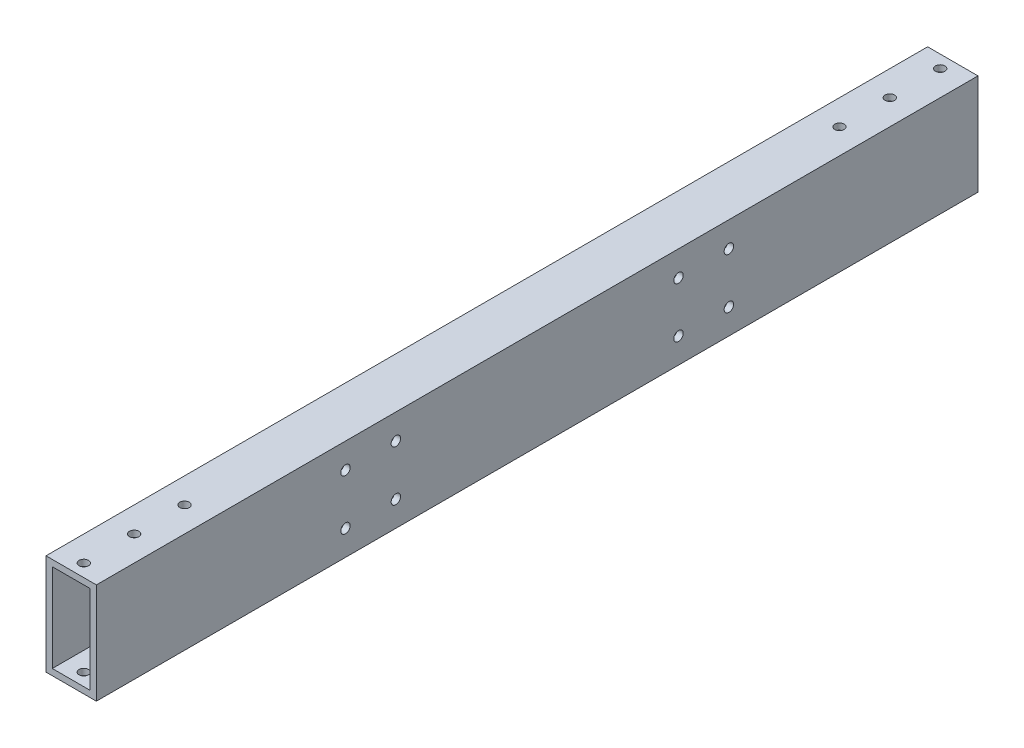
ISO-10303-21;
HEADER;
FILE_DESCRIPTION(('STEP AP214'),'2;1');
FILE_NAME('part.step','',(''),(''),'','','');
FILE_SCHEMA(('AUTOMOTIVE_DESIGN { 1 0 10303 214 1 1 1 1 }'));
ENDSEC;
DATA;
#1=APPLICATION_CONTEXT('core data for automotive mechanical design processes');
#2=APPLICATION_PROTOCOL_DEFINITION('international standard','automotive_design',2000,#1);
#3=PRODUCT_CONTEXT('',#1,'mechanical');
#4=PRODUCT('Part','Part','',(#3));
#5=PRODUCT_RELATED_PRODUCT_CATEGORY('part','',(#4));
#6=PRODUCT_DEFINITION_FORMATION('','',#4);
#7=PRODUCT_DEFINITION_CONTEXT('part definition',#1,'design');
#8=PRODUCT_DEFINITION('design','',#6,#7);
#9=PRODUCT_DEFINITION_SHAPE('','',#8);
#10=(LENGTH_UNIT() NAMED_UNIT(*) SI_UNIT(.MILLI.,.METRE.));
#11=(NAMED_UNIT(*) PLANE_ANGLE_UNIT() SI_UNIT($,.RADIAN.));
#12=(NAMED_UNIT(*) SI_UNIT($,.STERADIAN.) SOLID_ANGLE_UNIT());
#13=UNCERTAINTY_MEASURE_WITH_UNIT(LENGTH_MEASURE(1.E-05),#10,'distance_accuracy_value','');
#14=(GEOMETRIC_REPRESENTATION_CONTEXT(3) GLOBAL_UNCERTAINTY_ASSIGNED_CONTEXT((#13)) GLOBAL_UNIT_ASSIGNED_CONTEXT((#10,
#11,#12)) REPRESENTATION_CONTEXT('',''));
#15=CARTESIAN_POINT('',(0.,0.,0.));
#16=DIRECTION('',(0.,0.,1.));
#17=DIRECTION('',(1.,0.,0.));
#18=AXIS2_PLACEMENT_3D('',#15,#16,#17);
#19=CARTESIAN_POINT('',(12.7,25.4000000000001,444.5));
#20=DIRECTION('',(-1.,0.,0.));
#21=DIRECTION('',(0.,-1.,0.));
#22=AXIS2_PLACEMENT_3D('',#19,#20,#21);
#23=PLANE('',#22);
#24=CARTESIAN_POINT('',(12.7,12.7000000000001,125.603));
#25=DIRECTION('',(1.,0.,0.));
#26=DIRECTION('',(0.,1.,0.));
#27=AXIS2_PLACEMENT_3D('',#24,#25,#26);
#28=CIRCLE('',#27,2.38125000000001);
#29=CARTESIAN_POINT('',(12.7,15.0812500000001,125.603));
#30=VERTEX_POINT('',#29);
#31=EDGE_CURVE('E321',#30,#30,#28,.T.);
#32=ORIENTED_EDGE('',*,*,#31,.F.);
#33=EDGE_LOOP('',(#32));
#34=FACE_BOUND('',#33,.T.);
#35=CARTESIAN_POINT('',(12.7,12.7000000000001,151.003));
#36=DIRECTION('',(1.,0.,0.));
#37=DIRECTION('',(0.,1.,0.));
#38=AXIS2_PLACEMENT_3D('',#35,#36,#37);
#39=CIRCLE('',#38,2.38125000000001);
#40=CARTESIAN_POINT('',(12.7,15.0812500000001,151.003));
#41=VERTEX_POINT('',#40);
#42=EDGE_CURVE('E325',#41,#41,#39,.T.);
#43=ORIENTED_EDGE('',*,*,#42,.F.);
#44=EDGE_LOOP('',(#43));
#45=FACE_BOUND('',#44,.T.);
#46=CARTESIAN_POINT('',(12.7,-12.6999999999999,151.003));
#47=DIRECTION('',(1.,0.,0.));
#48=DIRECTION('',(0.,1.,0.));
#49=AXIS2_PLACEMENT_3D('',#46,#47,#48);
#50=CIRCLE('',#49,2.38125000000001);
#51=CARTESIAN_POINT('',(12.7,-10.3187499999999,151.003));
#52=VERTEX_POINT('',#51);
#53=EDGE_CURVE('E329',#52,#52,#50,.T.);
#54=ORIENTED_EDGE('',*,*,#53,.F.);
#55=EDGE_LOOP('',(#54));
#56=FACE_BOUND('',#55,.T.);
#57=CARTESIAN_POINT('',(12.7,-12.6999999999999,293.497));
#58=DIRECTION('',(1.,0.,0.));
#59=DIRECTION('',(0.,-1.,0.));
#60=AXIS2_PLACEMENT_3D('',#57,#58,#59);
#61=CIRCLE('',#60,2.38124999999995);
#62=CARTESIAN_POINT('',(12.7,-15.0812499999999,293.497));
#63=VERTEX_POINT('',#62);
#64=EDGE_CURVE('E333',#63,#63,#61,.T.);
#65=ORIENTED_EDGE('',*,*,#64,.F.);
#66=EDGE_LOOP('',(#65));
#67=FACE_BOUND('',#66,.T.);
#68=CARTESIAN_POINT('',(12.7,12.7000000000001,293.497));
#69=DIRECTION('',(1.,0.,0.));
#70=DIRECTION('',(0.,-1.,0.));
#71=AXIS2_PLACEMENT_3D('',#68,#69,#70);
#72=CIRCLE('',#71,2.38125000000001);
#73=CARTESIAN_POINT('',(12.7,10.3187500000001,293.497));
#74=VERTEX_POINT('',#73);
#75=EDGE_CURVE('E337',#74,#74,#72,.T.);
#76=ORIENTED_EDGE('',*,*,#75,.F.);
#77=EDGE_LOOP('',(#76));
#78=FACE_BOUND('',#77,.T.);
#79=CARTESIAN_POINT('',(12.7,12.7,318.897));
#80=DIRECTION('',(1.,0.,0.));
#81=DIRECTION('',(0.,-1.,0.));
#82=AXIS2_PLACEMENT_3D('',#79,#80,#81);
#83=CIRCLE('',#82,2.38124999999995);
#84=CARTESIAN_POINT('',(12.7,10.3187500000001,318.897));
#85=VERTEX_POINT('',#84);
#86=EDGE_CURVE('E341',#85,#85,#83,.T.);
#87=ORIENTED_EDGE('',*,*,#86,.F.);
#88=EDGE_LOOP('',(#87));
#89=FACE_BOUND('',#88,.T.);
#90=CARTESIAN_POINT('',(12.7,-12.6999999999999,318.897));
#91=DIRECTION('',(1.,0.,0.));
#92=DIRECTION('',(0.,-1.,0.));
#93=AXIS2_PLACEMENT_3D('',#90,#91,#92);
#94=CIRCLE('',#93,2.38125000000001);
#95=CARTESIAN_POINT('',(12.7,-15.08125,318.897));
#96=VERTEX_POINT('',#95);
#97=EDGE_CURVE('E345',#96,#96,#94,.T.);
#98=ORIENTED_EDGE('',*,*,#97,.F.);
#99=EDGE_LOOP('',(#98));
#100=FACE_BOUND('',#99,.T.);
#101=CARTESIAN_POINT('',(12.7,-12.6999999999999,125.603));
#102=DIRECTION('',(1.,0.,0.));
#103=DIRECTION('',(0.,1.,0.));
#104=AXIS2_PLACEMENT_3D('',#101,#102,#103);
#105=CIRCLE('',#104,2.38125000000001);
#106=CARTESIAN_POINT('',(12.7,-10.3187499999999,125.603));
#107=VERTEX_POINT('',#106);
#108=EDGE_CURVE('E225',#107,#107,#105,.T.);
#109=ORIENTED_EDGE('',*,*,#108,.F.);
#110=EDGE_LOOP('',(#109));
#111=FACE_BOUND('',#110,.T.);
#112=DIRECTION('',(0.,1.,0.));
#113=VECTOR('',#112,1.);
#114=CARTESIAN_POINT('',(12.7,25.4000000000001,0.));
#115=LINE('',#114,#113);
#116=CARTESIAN_POINT('',(12.7,-25.3999999999999,0.));
#117=VERTEX_POINT('',#116);
#118=CARTESIAN_POINT('',(12.7,25.4000000000001,0.));
#119=VERTEX_POINT('',#118);
#120=EDGE_CURVE('E168',#117,#119,#115,.T.);
#121=ORIENTED_EDGE('',*,*,#120,.T.);
#122=DIRECTION('',(0.,0.,-1.));
#123=VECTOR('',#122,1.);
#124=CARTESIAN_POINT('',(12.7,25.4000000000001,444.5));
#125=LINE('',#124,#123);
#126=CARTESIAN_POINT('',(12.7,25.4000000000001,444.5));
#127=VERTEX_POINT('',#126);
#128=EDGE_CURVE('E11',#127,#119,#125,.T.);
#129=ORIENTED_EDGE('',*,*,#128,.F.);
#130=DIRECTION('',(0.,1.,0.));
#131=VECTOR('',#130,1.);
#132=CARTESIAN_POINT('',(12.7,25.4000000000001,444.5));
#133=LINE('',#132,#131);
#134=CARTESIAN_POINT('',(12.7,-25.3999999999999,444.5));
#135=VERTEX_POINT('',#134);
#136=EDGE_CURVE('E153',#135,#127,#133,.T.);
#137=ORIENTED_EDGE('',*,*,#136,.F.);
#138=DIRECTION('',(0.,0.,-1.));
#139=VECTOR('',#138,1.);
#140=CARTESIAN_POINT('',(12.7,-25.3999999999999,444.5));
#141=LINE('',#140,#139);
#142=EDGE_CURVE('E167',#135,#117,#141,.T.);
#143=ORIENTED_EDGE('',*,*,#142,.T.);
#144=EDGE_LOOP('',(#121,#129,#137,#143));
#145=FACE_BOUND('',#144,.T.);
#146=ADVANCED_FACE('F41',(#34,#45,#56,#67,#78,#89,#100,#111,#145),#23,.F.);
#147=CARTESIAN_POINT('',(-12.7,25.4000000000001,444.5));
#148=DIRECTION('',(0.,-1.,0.));
#149=DIRECTION('',(0.,0.,-1.));
#150=AXIS2_PLACEMENT_3D('',#147,#148,#149);
#151=PLANE('',#150);
#152=CARTESIAN_POINT('',(0.,25.4000000000001,6.35));
#153=DIRECTION('',(0.,1.,0.));
#154=DIRECTION('',(0.,0.,1.));
#155=AXIS2_PLACEMENT_3D('',#152,#153,#154);
#156=CIRCLE('',#155,2.38125);
#157=CARTESIAN_POINT('',(0.,25.4000000000001,8.73125));
#158=VERTEX_POINT('',#157);
#159=EDGE_CURVE('E435',#158,#158,#156,.T.);
#160=ORIENTED_EDGE('',*,*,#159,.F.);
#161=EDGE_LOOP('',(#160));
#162=FACE_BOUND('',#161,.T.);
#163=CARTESIAN_POINT('',(0.,25.4000000000001,31.75));
#164=DIRECTION('',(0.,1.,0.));
#165=DIRECTION('',(0.,0.,1.));
#166=AXIS2_PLACEMENT_3D('',#163,#164,#165);
#167=CIRCLE('',#166,2.38125);
#168=CARTESIAN_POINT('',(0.,25.4000000000001,34.13125));
#169=VERTEX_POINT('',#168);
#170=EDGE_CURVE('E432',#169,#169,#167,.T.);
#171=ORIENTED_EDGE('',*,*,#170,.F.);
#172=EDGE_LOOP('',(#171));
#173=FACE_BOUND('',#172,.T.);
#174=CARTESIAN_POINT('',(0.,25.4000000000001,57.15));
#175=DIRECTION('',(0.,1.,0.));
#176=DIRECTION('',(0.,0.,1.));
#177=AXIS2_PLACEMENT_3D('',#174,#175,#176);
#178=CIRCLE('',#177,2.38125);
#179=CARTESIAN_POINT('',(0.,25.4000000000001,59.53125));
#180=VERTEX_POINT('',#179);
#181=EDGE_CURVE('E424',#180,#180,#178,.T.);
#182=ORIENTED_EDGE('',*,*,#181,.F.);
#183=EDGE_LOOP('',(#182));
#184=FACE_BOUND('',#183,.T.);
#185=CARTESIAN_POINT('',(0.,25.4000000000001,387.35));
#186=DIRECTION('',(0.,1.,0.));
#187=DIRECTION('',(0.,0.,-1.));
#188=AXIS2_PLACEMENT_3D('',#185,#186,#187);
#189=CIRCLE('',#188,2.38124999999998);
#190=CARTESIAN_POINT('',(0.,25.4000000000001,384.96875));
#191=VERTEX_POINT('',#190);
#192=EDGE_CURVE('E416',#191,#191,#189,.T.);
#193=ORIENTED_EDGE('',*,*,#192,.F.);
#194=EDGE_LOOP('',(#193));
#195=FACE_BOUND('',#194,.T.);
#196=CARTESIAN_POINT('',(0.,25.4000000000001,412.75));
#197=DIRECTION('',(0.,1.,0.));
#198=DIRECTION('',(0.,0.,-1.));
#199=AXIS2_PLACEMENT_3D('',#196,#197,#198);
#200=CIRCLE('',#199,2.38124999999998);
#201=CARTESIAN_POINT('',(0.,25.4000000000001,410.36875));
#202=VERTEX_POINT('',#201);
#203=EDGE_CURVE('E407',#202,#202,#200,.T.);
#204=ORIENTED_EDGE('',*,*,#203,.F.);
#205=EDGE_LOOP('',(#204));
#206=FACE_BOUND('',#205,.T.);
#207=CARTESIAN_POINT('',(0.,25.4000000000001,438.15));
#208=DIRECTION('',(0.,1.,0.));
#209=DIRECTION('',(0.,0.,-1.));
#210=AXIS2_PLACEMENT_3D('',#207,#208,#209);
#211=CIRCLE('',#210,2.38125000000002);
#212=CARTESIAN_POINT('',(0.,25.4000000000001,435.76875));
#213=VERTEX_POINT('',#212);
#214=EDGE_CURVE('E257',#213,#213,#211,.T.);
#215=ORIENTED_EDGE('',*,*,#214,.F.);
#216=EDGE_LOOP('',(#215));
#217=FACE_BOUND('',#216,.T.);
#218=DIRECTION('',(-1.,0.,0.));
#219=VECTOR('',#218,1.);
#220=CARTESIAN_POINT('',(-12.7,25.4000000000001,0.));
#221=LINE('',#220,#219);
#222=CARTESIAN_POINT('',(-12.7,25.4000000000001,0.));
#223=VERTEX_POINT('',#222);
#224=EDGE_CURVE('E172',#119,#223,#221,.T.);
#225=ORIENTED_EDGE('',*,*,#224,.T.);
#226=DIRECTION('',(0.,0.,-1.));
#227=VECTOR('',#226,1.);
#228=CARTESIAN_POINT('',(-12.7,25.4000000000001,444.5));
#229=LINE('',#228,#227);
#230=CARTESIAN_POINT('',(-12.7,25.4000000000001,444.5));
#231=VERTEX_POINT('',#230);
#232=EDGE_CURVE('E50',#231,#223,#229,.T.);
#233=ORIENTED_EDGE('',*,*,#232,.F.);
#234=DIRECTION('',(-1.,0.,0.));
#235=VECTOR('',#234,1.);
#236=CARTESIAN_POINT('',(-12.7,25.4000000000001,444.5));
#237=LINE('',#236,#235);
#238=EDGE_CURVE('E157',#127,#231,#237,.T.);
#239=ORIENTED_EDGE('',*,*,#238,.F.);
#240=ORIENTED_EDGE('',*,*,#128,.T.);
#241=EDGE_LOOP('',(#225,#233,#239,#240));
#242=FACE_BOUND('',#241,.T.);
#243=ADVANCED_FACE('F311',(#162,#173,#184,#195,#206,#217,#242),#151,.F.);
#244=CARTESIAN_POINT('',(-12.7,25.4000000000001,444.5));
#245=DIRECTION('',(1.,0.,0.));
#246=DIRECTION('',(0.,1.,0.));
#247=AXIS2_PLACEMENT_3D('',#244,#245,#246);
#248=PLANE('',#247);
#249=DIRECTION('',(0.,-1.,0.));
#250=VECTOR('',#249,1.);
#251=CARTESIAN_POINT('',(-12.7,25.4000000000001,0.));
#252=LINE('',#251,#250);
#253=CARTESIAN_POINT('',(-12.7,-25.3999999999999,0.));
#254=VERTEX_POINT('',#253);
#255=EDGE_CURVE('E175',#223,#254,#252,.T.);
#256=ORIENTED_EDGE('',*,*,#255,.T.);
#257=DIRECTION('',(0.,0.,-1.));
#258=VECTOR('',#257,1.);
#259=CARTESIAN_POINT('',(-12.7,-25.3999999999999,444.5));
#260=LINE('',#259,#258);
#261=CARTESIAN_POINT('',(-12.7,-25.3999999999999,444.5));
#262=VERTEX_POINT('',#261);
#263=EDGE_CURVE('E183',#262,#254,#260,.T.);
#264=ORIENTED_EDGE('',*,*,#263,.F.);
#265=DIRECTION('',(0.,-1.,0.));
#266=VECTOR('',#265,1.);
#267=CARTESIAN_POINT('',(-12.7,25.4000000000001,444.5));
#268=LINE('',#267,#266);
#269=EDGE_CURVE('E161',#231,#262,#268,.T.);
#270=ORIENTED_EDGE('',*,*,#269,.F.);
#271=ORIENTED_EDGE('',*,*,#232,.T.);
#272=EDGE_LOOP('',(#256,#264,#270,#271));
#273=FACE_BOUND('',#272,.T.);
#274=ADVANCED_FACE('F316',(#273),#248,.F.);
#275=CARTESIAN_POINT('',(-12.7,-25.3999999999999,444.5));
#276=DIRECTION('',(0.,1.,0.));
#277=DIRECTION('',(0.,0.,1.));
#278=AXIS2_PLACEMENT_3D('',#275,#276,#277);
#279=PLANE('',#278);
#280=CARTESIAN_POINT('',(0.,-25.3999999999999,6.35));
#281=DIRECTION('',(0.,1.,0.));
#282=DIRECTION('',(0.,0.,1.));
#283=AXIS2_PLACEMENT_3D('',#280,#281,#282);
#284=CIRCLE('',#283,2.38125);
#285=CARTESIAN_POINT('',(0.,-25.3999999999999,8.73125));
#286=VERTEX_POINT('',#285);
#287=EDGE_CURVE('E195',#286,#286,#284,.T.);
#288=ORIENTED_EDGE('',*,*,#287,.T.);
#289=EDGE_LOOP('',(#288));
#290=FACE_BOUND('',#289,.T.);
#291=CARTESIAN_POINT('',(0.,-25.3999999999999,31.75));
#292=DIRECTION('',(0.,1.,0.));
#293=DIRECTION('',(0.,0.,1.));
#294=AXIS2_PLACEMENT_3D('',#291,#292,#293);
#295=CIRCLE('',#294,2.38125);
#296=CARTESIAN_POINT('',(0.,-25.3999999999999,34.13125));
#297=VERTEX_POINT('',#296);
#298=EDGE_CURVE('E428',#297,#297,#295,.T.);
#299=ORIENTED_EDGE('',*,*,#298,.T.);
#300=EDGE_LOOP('',(#299));
#301=FACE_BOUND('',#300,.T.);
#302=CARTESIAN_POINT('',(0.,-25.3999999999999,57.15));
#303=DIRECTION('',(0.,1.,0.));
#304=DIRECTION('',(0.,0.,1.));
#305=AXIS2_PLACEMENT_3D('',#302,#303,#304);
#306=CIRCLE('',#305,2.38125);
#307=CARTESIAN_POINT('',(0.,-25.3999999999999,59.53125));
#308=VERTEX_POINT('',#307);
#309=EDGE_CURVE('E420',#308,#308,#306,.T.);
#310=ORIENTED_EDGE('',*,*,#309,.T.);
#311=EDGE_LOOP('',(#310));
#312=FACE_BOUND('',#311,.T.);
#313=CARTESIAN_POINT('',(0.,-25.3999999999999,387.35));
#314=DIRECTION('',(0.,1.,0.));
#315=DIRECTION('',(0.,0.,-1.));
#316=AXIS2_PLACEMENT_3D('',#313,#314,#315);
#317=CIRCLE('',#316,2.38124999999998);
#318=CARTESIAN_POINT('',(0.,-25.3999999999999,384.96875));
#319=VERTEX_POINT('',#318);
#320=EDGE_CURVE('E410',#319,#319,#317,.T.);
#321=ORIENTED_EDGE('',*,*,#320,.T.);
#322=EDGE_LOOP('',(#321));
#323=FACE_BOUND('',#322,.T.);
#324=CARTESIAN_POINT('',(0.,-25.3999999999999,412.75));
#325=DIRECTION('',(0.,1.,0.));
#326=DIRECTION('',(0.,0.,-1.));
#327=AXIS2_PLACEMENT_3D('',#324,#325,#326);
#328=CIRCLE('',#327,2.38124999999998);
#329=CARTESIAN_POINT('',(0.,-25.3999999999999,410.36875));
#330=VERTEX_POINT('',#329);
#331=EDGE_CURVE('E263',#330,#330,#328,.T.);
#332=ORIENTED_EDGE('',*,*,#331,.T.);
#333=EDGE_LOOP('',(#332));
#334=FACE_BOUND('',#333,.T.);
#335=CARTESIAN_POINT('',(0.,-25.3999999999999,438.15));
#336=DIRECTION('',(0.,1.,0.));
#337=DIRECTION('',(0.,0.,-1.));
#338=AXIS2_PLACEMENT_3D('',#335,#336,#337);
#339=CIRCLE('',#338,2.38125000000002);
#340=CARTESIAN_POINT('',(0.,-25.3999999999999,435.76875));
#341=VERTEX_POINT('',#340);
#342=EDGE_CURVE('E251',#341,#341,#339,.T.);
#343=ORIENTED_EDGE('',*,*,#342,.T.);
#344=EDGE_LOOP('',(#343));
#345=FACE_BOUND('',#344,.T.);
#346=DIRECTION('',(1.,0.,0.));
#347=VECTOR('',#346,1.);
#348=CARTESIAN_POINT('',(-12.7,-25.3999999999999,0.));
#349=LINE('',#348,#347);
#350=EDGE_CURVE('E158',#254,#117,#349,.T.);
#351=ORIENTED_EDGE('',*,*,#350,.T.);
#352=ORIENTED_EDGE('',*,*,#142,.F.);
#353=DIRECTION('',(1.,0.,0.));
#354=VECTOR('',#353,1.);
#355=CARTESIAN_POINT('',(-12.7,-25.3999999999999,444.5));
#356=LINE('',#355,#354);
#357=EDGE_CURVE('E164',#262,#135,#356,.T.);
#358=ORIENTED_EDGE('',*,*,#357,.F.);
#359=ORIENTED_EDGE('',*,*,#263,.T.);
#360=EDGE_LOOP('',(#351,#352,#358,#359));
#361=FACE_BOUND('',#360,.T.);
#362=ADVANCED_FACE('F361',(#290,#301,#312,#323,#334,#345,#361),#279,.F.);
#363=CARTESIAN_POINT('',(0.,0.,444.5));
#364=DIRECTION('',(0.,0.,1.));
#365=DIRECTION('',(1.,0.,0.));
#366=AXIS2_PLACEMENT_3D('',#363,#364,#365);
#367=PLANE('',#366);
#368=DIRECTION('',(0.,1.,0.));
#369=VECTOR('',#368,1.);
#370=CARTESIAN_POINT('',(9.52499999999998,25.4000000000001,444.5));
#371=LINE('',#370,#369);
#372=CARTESIAN_POINT('',(9.52499999999999,-22.2249999999999,444.5));
#373=VERTEX_POINT('',#372);
#374=CARTESIAN_POINT('',(9.52499999999998,22.2250000000001,444.5));
#375=VERTEX_POINT('',#374);
#376=EDGE_CURVE('E133',#373,#375,#371,.T.);
#377=ORIENTED_EDGE('',*,*,#376,.F.);
#378=DIRECTION('',(1.,0.,0.));
#379=VECTOR('',#378,1.);
#380=CARTESIAN_POINT('',(-12.7,-22.2249999999999,444.5));
#381=LINE('',#380,#379);
#382=CARTESIAN_POINT('',(-9.52500000000001,-22.2249999999999,444.5));
#383=VERTEX_POINT('',#382);
#384=EDGE_CURVE('E113',#383,#373,#381,.T.);
#385=ORIENTED_EDGE('',*,*,#384,.F.);
#386=DIRECTION('',(0.,-1.,0.));
#387=VECTOR('',#386,1.);
#388=CARTESIAN_POINT('',(-9.52500000000002,25.4000000000001,444.5));
#389=LINE('',#388,#387);
#390=CARTESIAN_POINT('',(-9.52500000000002,22.2250000000001,444.5));
#391=VERTEX_POINT('',#390);
#392=EDGE_CURVE('E148',#391,#383,#389,.T.);
#393=ORIENTED_EDGE('',*,*,#392,.F.);
#394=DIRECTION('',(-1.,0.,0.));
#395=VECTOR('',#394,1.);
#396=CARTESIAN_POINT('',(-12.7,22.2250000000001,444.5));
#397=LINE('',#396,#395);
#398=EDGE_CURVE('E138',#375,#391,#397,.T.);
#399=ORIENTED_EDGE('',*,*,#398,.F.);
#400=EDGE_LOOP('',(#377,#385,#393,#399));
#401=FACE_BOUND('',#400,.T.);
#402=ORIENTED_EDGE('',*,*,#136,.T.);
#403=ORIENTED_EDGE('',*,*,#238,.T.);
#404=ORIENTED_EDGE('',*,*,#269,.T.);
#405=ORIENTED_EDGE('',*,*,#357,.T.);
#406=EDGE_LOOP('',(#402,#403,#404,#405));
#407=FACE_BOUND('',#406,.T.);
#408=ADVANCED_FACE('F294',(#401,#407),#367,.T.);
#409=CARTESIAN_POINT('',(0.,0.,0.));
#410=DIRECTION('',(0.,0.,1.));
#411=DIRECTION('',(1.,0.,0.));
#412=AXIS2_PLACEMENT_3D('',#409,#410,#411);
#413=PLANE('',#412);
#414=DIRECTION('',(1.,0.,0.));
#415=VECTOR('',#414,1.);
#416=CARTESIAN_POINT('',(-12.7,-22.2249999999999,0.));
#417=LINE('',#416,#415);
#418=CARTESIAN_POINT('',(-9.52500000000001,-22.2249999999999,0.));
#419=VERTEX_POINT('',#418);
#420=CARTESIAN_POINT('',(9.52499999999999,-22.2249999999999,0.));
#421=VERTEX_POINT('',#420);
#422=EDGE_CURVE('E111',#419,#421,#417,.T.);
#423=ORIENTED_EDGE('',*,*,#422,.T.);
#424=DIRECTION('',(0.,1.,0.));
#425=VECTOR('',#424,1.);
#426=CARTESIAN_POINT('',(9.52499999999998,25.4000000000001,0.));
#427=LINE('',#426,#425);
#428=CARTESIAN_POINT('',(9.52499999999998,22.2250000000001,0.));
#429=VERTEX_POINT('',#428);
#430=EDGE_CURVE('E120',#421,#429,#427,.T.);
#431=ORIENTED_EDGE('',*,*,#430,.T.);
#432=DIRECTION('',(-1.,0.,0.));
#433=VECTOR('',#432,1.);
#434=CARTESIAN_POINT('',(-12.7,22.2250000000001,0.));
#435=LINE('',#434,#433);
#436=CARTESIAN_POINT('',(-9.52500000000002,22.2250000000001,0.));
#437=VERTEX_POINT('',#436);
#438=EDGE_CURVE('E127',#429,#437,#435,.T.);
#439=ORIENTED_EDGE('',*,*,#438,.T.);
#440=DIRECTION('',(0.,-1.,0.));
#441=VECTOR('',#440,1.);
#442=CARTESIAN_POINT('',(-9.52500000000002,25.4000000000001,0.));
#443=LINE('',#442,#441);
#444=EDGE_CURVE('E65',#437,#419,#443,.T.);
#445=ORIENTED_EDGE('',*,*,#444,.T.);
#446=EDGE_LOOP('',(#423,#431,#439,#445));
#447=FACE_BOUND('',#446,.T.);
#448=ORIENTED_EDGE('',*,*,#120,.F.);
#449=ORIENTED_EDGE('',*,*,#350,.F.);
#450=ORIENTED_EDGE('',*,*,#255,.F.);
#451=ORIENTED_EDGE('',*,*,#224,.F.);
#452=EDGE_LOOP('',(#448,#449,#450,#451));
#453=FACE_BOUND('',#452,.T.);
#454=ADVANCED_FACE('F130',(#447,#453),#413,.F.);
#455=CARTESIAN_POINT('',(9.52499999999998,25.4000000000001,444.5));
#456=DIRECTION('',(-1.,0.,0.));
#457=DIRECTION('',(0.,-1.,0.));
#458=AXIS2_PLACEMENT_3D('',#455,#456,#457);
#459=PLANE('',#458);
#460=CARTESIAN_POINT('',(9.52499999999998,12.7000000000001,125.603));
#461=DIRECTION('',(-1.,0.,0.));
#462=DIRECTION('',(0.,-1.,0.));
#463=AXIS2_PLACEMENT_3D('',#460,#461,#462);
#464=CIRCLE('',#463,2.38125000000001);
#465=CARTESIAN_POINT('',(9.52499999999998,10.3187500000001,125.603));
#466=VERTEX_POINT('',#465);
#467=EDGE_CURVE('E44',#466,#466,#464,.T.);
#468=ORIENTED_EDGE('',*,*,#467,.F.);
#469=EDGE_LOOP('',(#468));
#470=FACE_BOUND('',#469,.T.);
#471=CARTESIAN_POINT('',(9.52499999999998,12.7000000000001,151.003));
#472=DIRECTION('',(-1.,0.,0.));
#473=DIRECTION('',(0.,-1.,0.));
#474=AXIS2_PLACEMENT_3D('',#471,#472,#473);
#475=CIRCLE('',#474,2.38125000000001);
#476=CARTESIAN_POINT('',(9.52499999999998,10.3187500000001,151.003));
#477=VERTEX_POINT('',#476);
#478=EDGE_CURVE('E244',#477,#477,#475,.T.);
#479=ORIENTED_EDGE('',*,*,#478,.F.);
#480=EDGE_LOOP('',(#479));
#481=FACE_BOUND('',#480,.T.);
#482=CARTESIAN_POINT('',(9.52499999999998,-12.6999999999999,151.003));
#483=DIRECTION('',(-1.,0.,0.));
#484=DIRECTION('',(0.,-1.,0.));
#485=AXIS2_PLACEMENT_3D('',#482,#483,#484);
#486=CIRCLE('',#485,2.38125000000001);
#487=CARTESIAN_POINT('',(9.52499999999998,-15.0812499999999,151.003));
#488=VERTEX_POINT('',#487);
#489=EDGE_CURVE('E241',#488,#488,#486,.T.);
#490=ORIENTED_EDGE('',*,*,#489,.F.);
#491=EDGE_LOOP('',(#490));
#492=FACE_BOUND('',#491,.T.);
#493=CARTESIAN_POINT('',(9.52499999999998,-12.6999999999999,293.497));
#494=DIRECTION('',(-1.,0.,0.));
#495=DIRECTION('',(0.,-1.,0.));
#496=AXIS2_PLACEMENT_3D('',#493,#494,#495);
#497=CIRCLE('',#496,2.38124999999995);
#498=CARTESIAN_POINT('',(9.52499999999998,-15.0812499999999,293.497));
#499=VERTEX_POINT('',#498);
#500=EDGE_CURVE('E237',#499,#499,#497,.T.);
#501=ORIENTED_EDGE('',*,*,#500,.F.);
#502=EDGE_LOOP('',(#501));
#503=FACE_BOUND('',#502,.T.);
#504=CARTESIAN_POINT('',(9.52499999999998,12.7000000000001,293.497));
#505=DIRECTION('',(-1.,0.,0.));
#506=DIRECTION('',(0.,-1.,0.));
#507=AXIS2_PLACEMENT_3D('',#504,#505,#506);
#508=CIRCLE('',#507,2.38125000000001);
#509=CARTESIAN_POINT('',(9.52499999999998,10.31875,293.497));
#510=VERTEX_POINT('',#509);
#511=EDGE_CURVE('E233',#510,#510,#508,.T.);
#512=ORIENTED_EDGE('',*,*,#511,.F.);
#513=EDGE_LOOP('',(#512));
#514=FACE_BOUND('',#513,.T.);
#515=CARTESIAN_POINT('',(9.52499999999998,12.7,318.897));
#516=DIRECTION('',(-1.,0.,0.));
#517=DIRECTION('',(0.,-1.,0.));
#518=AXIS2_PLACEMENT_3D('',#515,#516,#517);
#519=CIRCLE('',#518,2.38124999999995);
#520=CARTESIAN_POINT('',(9.52499999999998,10.3187500000001,318.897));
#521=VERTEX_POINT('',#520);
#522=EDGE_CURVE('E229',#521,#521,#519,.T.);
#523=ORIENTED_EDGE('',*,*,#522,.F.);
#524=EDGE_LOOP('',(#523));
#525=FACE_BOUND('',#524,.T.);
#526=CARTESIAN_POINT('',(9.52499999999998,-12.7,318.897));
#527=DIRECTION('',(-1.,0.,0.));
#528=DIRECTION('',(0.,-1.,0.));
#529=AXIS2_PLACEMENT_3D('',#526,#527,#528);
#530=CIRCLE('',#529,2.38125000000001);
#531=CARTESIAN_POINT('',(9.52499999999998,-15.08125,318.897));
#532=VERTEX_POINT('',#531);
#533=EDGE_CURVE('E224',#532,#532,#530,.T.);
#534=ORIENTED_EDGE('',*,*,#533,.F.);
#535=EDGE_LOOP('',(#534));
#536=FACE_BOUND('',#535,.T.);
#537=CARTESIAN_POINT('',(9.52499999999998,-12.6999999999999,125.603));
#538=DIRECTION('',(-1.,0.,0.));
#539=DIRECTION('',(0.,-1.,0.));
#540=AXIS2_PLACEMENT_3D('',#537,#538,#539);
#541=CIRCLE('',#540,2.38125000000001);
#542=CARTESIAN_POINT('',(9.52499999999998,-15.0812499999999,125.603));
#543=VERTEX_POINT('',#542);
#544=EDGE_CURVE('E220',#543,#543,#541,.T.);
#545=ORIENTED_EDGE('',*,*,#544,.F.);
#546=EDGE_LOOP('',(#545));
#547=FACE_BOUND('',#546,.T.);
#548=ORIENTED_EDGE('',*,*,#430,.F.);
#549=DIRECTION('',(0.,0.,-1.));
#550=VECTOR('',#549,1.);
#551=CARTESIAN_POINT('',(9.52499999999999,-22.2249999999999,444.5));
#552=LINE('',#551,#550);
#553=EDGE_CURVE('E107',#373,#421,#552,.T.);
#554=ORIENTED_EDGE('',*,*,#553,.F.);
#555=ORIENTED_EDGE('',*,*,#376,.T.);
#556=DIRECTION('',(0.,0.,-1.));
#557=VECTOR('',#556,1.);
#558=CARTESIAN_POINT('',(9.52499999999998,22.2250000000001,444.5));
#559=LINE('',#558,#557);
#560=EDGE_CURVE('E123',#375,#429,#559,.T.);
#561=ORIENTED_EDGE('',*,*,#560,.T.);
#562=EDGE_LOOP('',(#548,#554,#555,#561));
#563=FACE_BOUND('',#562,.T.);
#564=ADVANCED_FACE('F121',(#470,#481,#492,#503,#514,#525,#536,#547,#563),#459,.T.);
#565=CARTESIAN_POINT('',(-12.7,22.2250000000001,444.5));
#566=DIRECTION('',(0.,-1.,0.));
#567=DIRECTION('',(0.,0.,-1.));
#568=AXIS2_PLACEMENT_3D('',#565,#566,#567);
#569=PLANE('',#568);
#570=CARTESIAN_POINT('',(0.,22.2250000000001,6.35));
#571=DIRECTION('',(0.,-1.,0.));
#572=DIRECTION('',(0.,0.,-1.));
#573=AXIS2_PLACEMENT_3D('',#570,#571,#572);
#574=CIRCLE('',#573,2.38125);
#575=CARTESIAN_POINT('',(0.,22.2250000000001,3.96875));
#576=VERTEX_POINT('',#575);
#577=EDGE_CURVE('E128',#576,#576,#574,.T.);
#578=ORIENTED_EDGE('',*,*,#577,.F.);
#579=EDGE_LOOP('',(#578));
#580=FACE_BOUND('',#579,.T.);
#581=CARTESIAN_POINT('',(0.,22.2250000000001,31.75));
#582=DIRECTION('',(0.,-1.,0.));
#583=DIRECTION('',(0.,0.,-1.));
#584=AXIS2_PLACEMENT_3D('',#581,#582,#583);
#585=CIRCLE('',#584,2.38125);
#586=CARTESIAN_POINT('',(0.,22.2250000000001,29.36875));
#587=VERTEX_POINT('',#586);
#588=EDGE_CURVE('E215',#587,#587,#585,.T.);
#589=ORIENTED_EDGE('',*,*,#588,.F.);
#590=EDGE_LOOP('',(#589));
#591=FACE_BOUND('',#590,.T.);
#592=CARTESIAN_POINT('',(0.,22.2250000000001,57.15));
#593=DIRECTION('',(0.,-1.,0.));
#594=DIRECTION('',(0.,0.,-1.));
#595=AXIS2_PLACEMENT_3D('',#592,#593,#594);
#596=CIRCLE('',#595,2.38125);
#597=CARTESIAN_POINT('',(0.,22.2250000000001,54.76875));
#598=VERTEX_POINT('',#597);
#599=EDGE_CURVE('E210',#598,#598,#596,.T.);
#600=ORIENTED_EDGE('',*,*,#599,.F.);
#601=EDGE_LOOP('',(#600));
#602=FACE_BOUND('',#601,.T.);
#603=CARTESIAN_POINT('',(0.,22.2250000000001,387.35));
#604=DIRECTION('',(0.,-1.,0.));
#605=DIRECTION('',(0.,0.,-1.));
#606=AXIS2_PLACEMENT_3D('',#603,#604,#605);
#607=CIRCLE('',#606,2.38124999999998);
#608=CARTESIAN_POINT('',(0.,22.2250000000001,384.96875));
#609=VERTEX_POINT('',#608);
#610=EDGE_CURVE('E205',#609,#609,#607,.T.);
#611=ORIENTED_EDGE('',*,*,#610,.F.);
#612=EDGE_LOOP('',(#611));
#613=FACE_BOUND('',#612,.T.);
#614=CARTESIAN_POINT('',(0.,22.2250000000001,412.75));
#615=DIRECTION('',(0.,-1.,0.));
#616=DIRECTION('',(0.,0.,-1.));
#617=AXIS2_PLACEMENT_3D('',#614,#615,#616);
#618=CIRCLE('',#617,2.38124999999998);
#619=CARTESIAN_POINT('',(0.,22.2250000000001,410.36875));
#620=VERTEX_POINT('',#619);
#621=EDGE_CURVE('E200',#620,#620,#618,.T.);
#622=ORIENTED_EDGE('',*,*,#621,.F.);
#623=EDGE_LOOP('',(#622));
#624=FACE_BOUND('',#623,.T.);
#625=CARTESIAN_POINT('',(0.,22.2250000000001,438.15));
#626=DIRECTION('',(0.,-1.,0.));
#627=DIRECTION('',(0.,0.,-1.));
#628=AXIS2_PLACEMENT_3D('',#625,#626,#627);
#629=CIRCLE('',#628,2.38125000000002);
#630=CARTESIAN_POINT('',(0.,22.2250000000001,435.76875));
#631=VERTEX_POINT('',#630);
#632=EDGE_CURVE('E194',#631,#631,#629,.T.);
#633=ORIENTED_EDGE('',*,*,#632,.F.);
#634=EDGE_LOOP('',(#633));
#635=FACE_BOUND('',#634,.T.);
#636=ORIENTED_EDGE('',*,*,#438,.F.);
#637=ORIENTED_EDGE('',*,*,#560,.F.);
#638=ORIENTED_EDGE('',*,*,#398,.T.);
#639=DIRECTION('',(0.,0.,-1.));
#640=VECTOR('',#639,1.);
#641=CARTESIAN_POINT('',(-9.52500000000002,22.2250000000001,444.5));
#642=LINE('',#641,#640);
#643=EDGE_CURVE('E285',#391,#437,#642,.T.);
#644=ORIENTED_EDGE('',*,*,#643,.T.);
#645=EDGE_LOOP('',(#636,#637,#638,#644));
#646=FACE_BOUND('',#645,.T.);
#647=ADVANCED_FACE('F297',(#580,#591,#602,#613,#624,#635,#646),#569,.T.);
#648=CARTESIAN_POINT('',(-9.52500000000002,25.4000000000001,444.5));
#649=DIRECTION('',(1.,0.,0.));
#650=DIRECTION('',(0.,1.,0.));
#651=AXIS2_PLACEMENT_3D('',#648,#649,#650);
#652=PLANE('',#651);
#653=ORIENTED_EDGE('',*,*,#444,.F.);
#654=ORIENTED_EDGE('',*,*,#643,.F.);
#655=ORIENTED_EDGE('',*,*,#392,.T.);
#656=DIRECTION('',(0.,0.,-1.));
#657=VECTOR('',#656,1.);
#658=CARTESIAN_POINT('',(-9.52500000000001,-22.2249999999999,444.5));
#659=LINE('',#658,#657);
#660=EDGE_CURVE('E58',#383,#419,#659,.T.);
#661=ORIENTED_EDGE('',*,*,#660,.T.);
#662=EDGE_LOOP('',(#653,#654,#655,#661));
#663=FACE_BOUND('',#662,.T.);
#664=ADVANCED_FACE('F290',(#663),#652,.T.);
#665=CARTESIAN_POINT('',(-12.7,-22.2249999999999,444.5));
#666=DIRECTION('',(0.,1.,0.));
#667=DIRECTION('',(0.,0.,1.));
#668=AXIS2_PLACEMENT_3D('',#665,#666,#667);
#669=PLANE('',#668);
#670=CARTESIAN_POINT('',(0.,-22.2249999999999,6.35));
#671=DIRECTION('',(0.,1.,0.));
#672=DIRECTION('',(0.,0.,1.));
#673=AXIS2_PLACEMENT_3D('',#670,#671,#672);
#674=CIRCLE('',#673,2.38125);
#675=CARTESIAN_POINT('',(0.,-22.2249999999999,8.73125));
#676=VERTEX_POINT('',#675);
#677=EDGE_CURVE('E216',#676,#676,#674,.T.);
#678=ORIENTED_EDGE('',*,*,#677,.F.);
#679=EDGE_LOOP('',(#678));
#680=FACE_BOUND('',#679,.T.);
#681=CARTESIAN_POINT('',(0.,-22.2249999999999,31.75));
#682=DIRECTION('',(0.,1.,0.));
#683=DIRECTION('',(0.,0.,1.));
#684=AXIS2_PLACEMENT_3D('',#681,#682,#683);
#685=CIRCLE('',#684,2.38125);
#686=CARTESIAN_POINT('',(0.,-22.2249999999999,34.13125));
#687=VERTEX_POINT('',#686);
#688=EDGE_CURVE('E211',#687,#687,#685,.T.);
#689=ORIENTED_EDGE('',*,*,#688,.F.);
#690=EDGE_LOOP('',(#689));
#691=FACE_BOUND('',#690,.T.);
#692=CARTESIAN_POINT('',(0.,-22.2249999999999,57.15));
#693=DIRECTION('',(0.,1.,0.));
#694=DIRECTION('',(0.,0.,1.));
#695=AXIS2_PLACEMENT_3D('',#692,#693,#694);
#696=CIRCLE('',#695,2.38125);
#697=CARTESIAN_POINT('',(0.,-22.2249999999999,59.53125));
#698=VERTEX_POINT('',#697);
#699=EDGE_CURVE('E206',#698,#698,#696,.T.);
#700=ORIENTED_EDGE('',*,*,#699,.F.);
#701=EDGE_LOOP('',(#700));
#702=FACE_BOUND('',#701,.T.);
#703=CARTESIAN_POINT('',(0.,-22.2249999999999,387.35));
#704=DIRECTION('',(0.,1.,0.));
#705=DIRECTION('',(0.,0.,1.));
#706=AXIS2_PLACEMENT_3D('',#703,#704,#705);
#707=CIRCLE('',#706,2.38124999999998);
#708=CARTESIAN_POINT('',(0.,-22.2249999999999,389.73125));
#709=VERTEX_POINT('',#708);
#710=EDGE_CURVE('E201',#709,#709,#707,.T.);
#711=ORIENTED_EDGE('',*,*,#710,.F.);
#712=EDGE_LOOP('',(#711));
#713=FACE_BOUND('',#712,.T.);
#714=CARTESIAN_POINT('',(0.,-22.2249999999999,412.75));
#715=DIRECTION('',(0.,1.,0.));
#716=DIRECTION('',(0.,0.,1.));
#717=AXIS2_PLACEMENT_3D('',#714,#715,#716);
#718=CIRCLE('',#717,2.38124999999998);
#719=CARTESIAN_POINT('',(0.,-22.2249999999999,415.13125));
#720=VERTEX_POINT('',#719);
#721=EDGE_CURVE('E196',#720,#720,#718,.T.);
#722=ORIENTED_EDGE('',*,*,#721,.F.);
#723=EDGE_LOOP('',(#722));
#724=FACE_BOUND('',#723,.T.);
#725=CARTESIAN_POINT('',(0.,-22.2249999999999,438.15));
#726=DIRECTION('',(0.,1.,0.));
#727=DIRECTION('',(0.,0.,1.));
#728=AXIS2_PLACEMENT_3D('',#725,#726,#727);
#729=CIRCLE('',#728,2.38125000000002);
#730=CARTESIAN_POINT('',(0.,-22.2249999999999,440.53125));
#731=VERTEX_POINT('',#730);
#732=EDGE_CURVE('E190',#731,#731,#729,.T.);
#733=ORIENTED_EDGE('',*,*,#732,.F.);
#734=EDGE_LOOP('',(#733));
#735=FACE_BOUND('',#734,.T.);
#736=ORIENTED_EDGE('',*,*,#422,.F.);
#737=ORIENTED_EDGE('',*,*,#660,.F.);
#738=ORIENTED_EDGE('',*,*,#384,.T.);
#739=ORIENTED_EDGE('',*,*,#553,.T.);
#740=EDGE_LOOP('',(#736,#737,#738,#739));
#741=FACE_BOUND('',#740,.T.);
#742=ADVANCED_FACE('F109',(#680,#691,#702,#713,#724,#735,#741),#669,.T.);
#743=CARTESIAN_POINT('',(0.,-25.3999999999999,438.15));
#744=DIRECTION('',(0.,1.,0.));
#745=DIRECTION('',(0.,0.,1.));
#746=AXIS2_PLACEMENT_3D('',#743,#744,#745);
#747=CYLINDRICAL_SURFACE('',#746,2.38125000000002);
#748=ORIENTED_EDGE('',*,*,#732,.T.);
#749=EDGE_LOOP('',(#748));
#750=FACE_BOUND('',#749,.T.);
#751=ORIENTED_EDGE('',*,*,#342,.F.);
#752=EDGE_LOOP('',(#751));
#753=FACE_BOUND('',#752,.T.);
#754=ADVANCED_FACE('F376',(#750,#753),#747,.F.);
#755=CARTESIAN_POINT('',(0.,-25.3999999999999,412.75));
#756=DIRECTION('',(0.,1.,0.));
#757=DIRECTION('',(0.,0.,1.));
#758=AXIS2_PLACEMENT_3D('',#755,#756,#757);
#759=CYLINDRICAL_SURFACE('',#758,2.38124999999998);
#760=ORIENTED_EDGE('',*,*,#721,.T.);
#761=EDGE_LOOP('',(#760));
#762=FACE_BOUND('',#761,.T.);
#763=ORIENTED_EDGE('',*,*,#331,.F.);
#764=EDGE_LOOP('',(#763));
#765=FACE_BOUND('',#764,.T.);
#766=ADVANCED_FACE('F381',(#762,#765),#759,.F.);
#767=CARTESIAN_POINT('',(0.,-25.3999999999999,387.35));
#768=DIRECTION('',(0.,1.,0.));
#769=DIRECTION('',(0.,0.,1.));
#770=AXIS2_PLACEMENT_3D('',#767,#768,#769);
#771=CYLINDRICAL_SURFACE('',#770,2.38124999999998);
#772=ORIENTED_EDGE('',*,*,#710,.T.);
#773=EDGE_LOOP('',(#772));
#774=FACE_BOUND('',#773,.T.);
#775=ORIENTED_EDGE('',*,*,#320,.F.);
#776=EDGE_LOOP('',(#775));
#777=FACE_BOUND('',#776,.T.);
#778=ADVANCED_FACE('F400',(#774,#777),#771,.F.);
#779=CARTESIAN_POINT('',(0.,-25.3999999999999,57.15));
#780=DIRECTION('',(0.,1.,0.));
#781=DIRECTION('',(0.,0.,1.));
#782=AXIS2_PLACEMENT_3D('',#779,#780,#781);
#783=CYLINDRICAL_SURFACE('',#782,2.38125);
#784=ORIENTED_EDGE('',*,*,#699,.T.);
#785=EDGE_LOOP('',(#784));
#786=FACE_BOUND('',#785,.T.);
#787=ORIENTED_EDGE('',*,*,#309,.F.);
#788=EDGE_LOOP('',(#787));
#789=FACE_BOUND('',#788,.T.);
#790=ADVANCED_FACE('F497',(#786,#789),#783,.F.);
#791=CARTESIAN_POINT('',(0.,-25.3999999999999,31.75));
#792=DIRECTION('',(0.,1.,0.));
#793=DIRECTION('',(0.,0.,1.));
#794=AXIS2_PLACEMENT_3D('',#791,#792,#793);
#795=CYLINDRICAL_SURFACE('',#794,2.38125);
#796=ORIENTED_EDGE('',*,*,#688,.T.);
#797=EDGE_LOOP('',(#796));
#798=FACE_BOUND('',#797,.T.);
#799=ORIENTED_EDGE('',*,*,#298,.F.);
#800=EDGE_LOOP('',(#799));
#801=FACE_BOUND('',#800,.T.);
#802=ADVANCED_FACE('F493',(#798,#801),#795,.F.);
#803=CARTESIAN_POINT('',(0.,-25.3999999999999,6.35));
#804=DIRECTION('',(0.,1.,0.));
#805=DIRECTION('',(0.,0.,1.));
#806=AXIS2_PLACEMENT_3D('',#803,#804,#805);
#807=CYLINDRICAL_SURFACE('',#806,2.38125);
#808=ORIENTED_EDGE('',*,*,#677,.T.);
#809=EDGE_LOOP('',(#808));
#810=FACE_BOUND('',#809,.T.);
#811=ORIENTED_EDGE('',*,*,#287,.F.);
#812=EDGE_LOOP('',(#811));
#813=FACE_BOUND('',#812,.T.);
#814=ADVANCED_FACE('F490',(#810,#813),#807,.F.);
#815=ORIENTED_EDGE('',*,*,#632,.T.);
#816=EDGE_LOOP('',(#815));
#817=FACE_BOUND('',#816,.T.);
#818=ORIENTED_EDGE('',*,*,#214,.T.);
#819=EDGE_LOOP('',(#818));
#820=FACE_BOUND('',#819,.T.);
#821=ADVANCED_FACE('F384',(#817,#820),#747,.F.);
#822=ORIENTED_EDGE('',*,*,#621,.T.);
#823=EDGE_LOOP('',(#822));
#824=FACE_BOUND('',#823,.T.);
#825=ORIENTED_EDGE('',*,*,#203,.T.);
#826=EDGE_LOOP('',(#825));
#827=FACE_BOUND('',#826,.T.);
#828=ADVANCED_FACE('F402',(#824,#827),#759,.F.);
#829=ORIENTED_EDGE('',*,*,#610,.T.);
#830=EDGE_LOOP('',(#829));
#831=FACE_BOUND('',#830,.T.);
#832=ORIENTED_EDGE('',*,*,#192,.T.);
#833=EDGE_LOOP('',(#832));
#834=FACE_BOUND('',#833,.T.);
#835=ADVANCED_FACE('F506',(#831,#834),#771,.F.);
#836=ORIENTED_EDGE('',*,*,#599,.T.);
#837=EDGE_LOOP('',(#836));
#838=FACE_BOUND('',#837,.T.);
#839=ORIENTED_EDGE('',*,*,#181,.T.);
#840=EDGE_LOOP('',(#839));
#841=FACE_BOUND('',#840,.T.);
#842=ADVANCED_FACE('F503',(#838,#841),#783,.F.);
#843=ORIENTED_EDGE('',*,*,#588,.T.);
#844=EDGE_LOOP('',(#843));
#845=FACE_BOUND('',#844,.T.);
#846=ORIENTED_EDGE('',*,*,#170,.T.);
#847=EDGE_LOOP('',(#846));
#848=FACE_BOUND('',#847,.T.);
#849=ADVANCED_FACE('F499',(#845,#848),#795,.F.);
#850=ORIENTED_EDGE('',*,*,#577,.T.);
#851=EDGE_LOOP('',(#850));
#852=FACE_BOUND('',#851,.T.);
#853=ORIENTED_EDGE('',*,*,#159,.T.);
#854=EDGE_LOOP('',(#853));
#855=FACE_BOUND('',#854,.T.);
#856=ADVANCED_FACE('F488',(#852,#855),#807,.F.);
#857=CARTESIAN_POINT('',(6.34999999999999,-12.6999999999999,125.603));
#858=DIRECTION('',(1.,0.,0.));
#859=DIRECTION('',(0.,1.,0.));
#860=AXIS2_PLACEMENT_3D('',#857,#858,#859);
#861=CYLINDRICAL_SURFACE('',#860,2.38125000000001);
#862=ORIENTED_EDGE('',*,*,#544,.T.);
#863=EDGE_LOOP('',(#862));
#864=FACE_BOUND('',#863,.T.);
#865=ORIENTED_EDGE('',*,*,#108,.T.);
#866=EDGE_LOOP('',(#865));
#867=FACE_BOUND('',#866,.T.);
#868=ADVANCED_FACE('F475',(#864,#867),#861,.F.);
#869=CARTESIAN_POINT('',(6.34999999999999,-12.7,318.897));
#870=DIRECTION('',(1.,0.,0.));
#871=DIRECTION('',(0.,1.,0.));
#872=AXIS2_PLACEMENT_3D('',#869,#870,#871);
#873=CYLINDRICAL_SURFACE('',#872,2.38125000000001);
#874=ORIENTED_EDGE('',*,*,#533,.T.);
#875=EDGE_LOOP('',(#874));
#876=FACE_BOUND('',#875,.T.);
#877=ORIENTED_EDGE('',*,*,#97,.T.);
#878=EDGE_LOOP('',(#877));
#879=FACE_BOUND('',#878,.T.);
#880=ADVANCED_FACE('F469',(#876,#879),#873,.F.);
#881=CARTESIAN_POINT('',(6.34999999999998,12.7,318.897));
#882=DIRECTION('',(1.,0.,0.));
#883=DIRECTION('',(0.,1.,0.));
#884=AXIS2_PLACEMENT_3D('',#881,#882,#883);
#885=CYLINDRICAL_SURFACE('',#884,2.38124999999995);
#886=ORIENTED_EDGE('',*,*,#522,.T.);
#887=EDGE_LOOP('',(#886));
#888=FACE_BOUND('',#887,.T.);
#889=ORIENTED_EDGE('',*,*,#86,.T.);
#890=EDGE_LOOP('',(#889));
#891=FACE_BOUND('',#890,.T.);
#892=ADVANCED_FACE('F459',(#888,#891),#885,.F.);
#893=CARTESIAN_POINT('',(6.34999999999998,12.7000000000001,293.497));
#894=DIRECTION('',(1.,0.,0.));
#895=DIRECTION('',(0.,1.,0.));
#896=AXIS2_PLACEMENT_3D('',#893,#894,#895);
#897=CYLINDRICAL_SURFACE('',#896,2.38125000000001);
#898=ORIENTED_EDGE('',*,*,#511,.T.);
#899=EDGE_LOOP('',(#898));
#900=FACE_BOUND('',#899,.T.);
#901=ORIENTED_EDGE('',*,*,#75,.T.);
#902=EDGE_LOOP('',(#901));
#903=FACE_BOUND('',#902,.T.);
#904=ADVANCED_FACE('F456',(#900,#903),#897,.F.);
#905=CARTESIAN_POINT('',(6.34999999999999,-12.6999999999999,293.497));
#906=DIRECTION('',(1.,0.,0.));
#907=DIRECTION('',(0.,1.,0.));
#908=AXIS2_PLACEMENT_3D('',#905,#906,#907);
#909=CYLINDRICAL_SURFACE('',#908,2.38124999999995);
#910=ORIENTED_EDGE('',*,*,#500,.T.);
#911=EDGE_LOOP('',(#910));
#912=FACE_BOUND('',#911,.T.);
#913=ORIENTED_EDGE('',*,*,#64,.T.);
#914=EDGE_LOOP('',(#913));
#915=FACE_BOUND('',#914,.T.);
#916=ADVANCED_FACE('F458',(#912,#915),#909,.F.);
#917=CARTESIAN_POINT('',(6.34999999999999,-12.6999999999999,151.003));
#918=DIRECTION('',(1.,0.,0.));
#919=DIRECTION('',(0.,1.,0.));
#920=AXIS2_PLACEMENT_3D('',#917,#918,#919);
#921=CYLINDRICAL_SURFACE('',#920,2.38125000000001);
#922=ORIENTED_EDGE('',*,*,#489,.T.);
#923=EDGE_LOOP('',(#922));
#924=FACE_BOUND('',#923,.T.);
#925=ORIENTED_EDGE('',*,*,#53,.T.);
#926=EDGE_LOOP('',(#925));
#927=FACE_BOUND('',#926,.T.);
#928=ADVANCED_FACE('F466',(#924,#927),#921,.F.);
#929=CARTESIAN_POINT('',(6.34999999999998,12.7000000000001,151.003));
#930=DIRECTION('',(1.,0.,0.));
#931=DIRECTION('',(0.,1.,0.));
#932=AXIS2_PLACEMENT_3D('',#929,#930,#931);
#933=CYLINDRICAL_SURFACE('',#932,2.38125000000001);
#934=ORIENTED_EDGE('',*,*,#478,.T.);
#935=EDGE_LOOP('',(#934));
#936=FACE_BOUND('',#935,.T.);
#937=ORIENTED_EDGE('',*,*,#42,.T.);
#938=EDGE_LOOP('',(#937));
#939=FACE_BOUND('',#938,.T.);
#940=ADVANCED_FACE('F480',(#936,#939),#933,.F.);
#941=CARTESIAN_POINT('',(6.34999999999998,12.7000000000001,125.603));
#942=DIRECTION('',(1.,0.,0.));
#943=DIRECTION('',(0.,1.,0.));
#944=AXIS2_PLACEMENT_3D('',#941,#942,#943);
#945=CYLINDRICAL_SURFACE('',#944,2.38125000000001);
#946=ORIENTED_EDGE('',*,*,#467,.T.);
#947=EDGE_LOOP('',(#946));
#948=FACE_BOUND('',#947,.T.);
#949=ORIENTED_EDGE('',*,*,#31,.T.);
#950=EDGE_LOOP('',(#949));
#951=FACE_BOUND('',#950,.T.);
#952=ADVANCED_FACE('F477',(#948,#951),#945,.F.);
#953=CLOSED_SHELL('',(#146,#243,#274,#362,#408,#454,#564,#647,#664,#742,#754,#766,#778,#790,
#802,#814,#821,#828,#835,#842,#849,#856,#868,#880,#892,#904,#916,#928,#940,#952));
#954=MANIFOLD_SOLID_BREP('B2',#953);
#955=ADVANCED_BREP_SHAPE_REPRESENTATION('',(#18,#954),#14);
#956=SHAPE_DEFINITION_REPRESENTATION(#9,#955);
ENDSEC;
END-ISO-10303-21;
